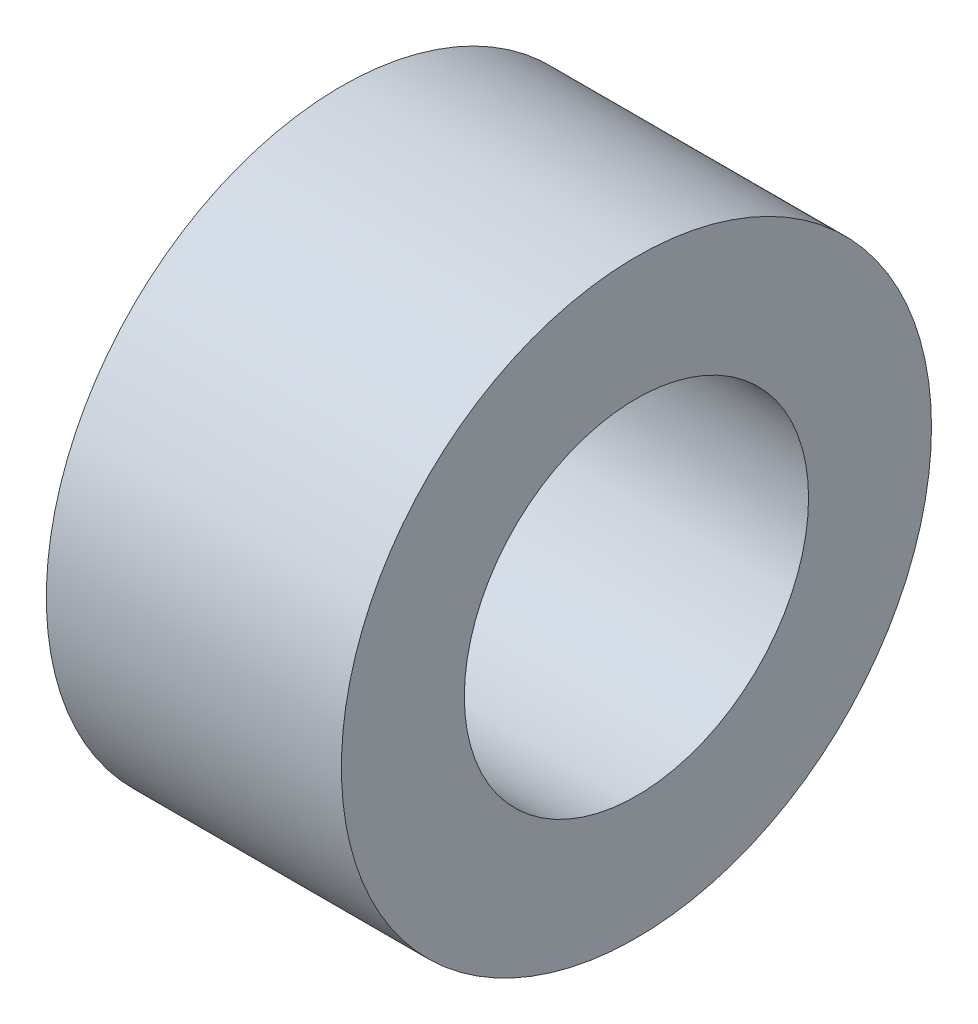
ISO-10303-21;
HEADER;
FILE_DESCRIPTION(('STEP AP214'),'2;1');
FILE_NAME('part.step','',(''),(''),'','','');
FILE_SCHEMA(('AUTOMOTIVE_DESIGN { 1 0 10303 214 1 1 1 1 }'));
ENDSEC;
DATA;
#1=APPLICATION_CONTEXT('core data for automotive mechanical design processes');
#2=APPLICATION_PROTOCOL_DEFINITION('international standard','automotive_design',2000,#1);
#3=PRODUCT_CONTEXT('',#1,'mechanical');
#4=PRODUCT('Part','Part','',(#3));
#5=PRODUCT_RELATED_PRODUCT_CATEGORY('part','',(#4));
#6=PRODUCT_DEFINITION_FORMATION('','',#4);
#7=PRODUCT_DEFINITION_CONTEXT('part definition',#1,'design');
#8=PRODUCT_DEFINITION('design','',#6,#7);
#9=PRODUCT_DEFINITION_SHAPE('','',#8);
#10=(LENGTH_UNIT() NAMED_UNIT(*) SI_UNIT(.MILLI.,.METRE.));
#11=(NAMED_UNIT(*) PLANE_ANGLE_UNIT() SI_UNIT($,.RADIAN.));
#12=(NAMED_UNIT(*) SI_UNIT($,.STERADIAN.) SOLID_ANGLE_UNIT());
#13=UNCERTAINTY_MEASURE_WITH_UNIT(LENGTH_MEASURE(1.E-05),#10,'distance_accuracy_value','');
#14=(GEOMETRIC_REPRESENTATION_CONTEXT(3) GLOBAL_UNCERTAINTY_ASSIGNED_CONTEXT((#13)) GLOBAL_UNIT_ASSIGNED_CONTEXT((#10,
#11,#12)) REPRESENTATION_CONTEXT('',''));
#15=CARTESIAN_POINT('',(0.,0.,0.));
#16=DIRECTION('',(0.,0.,1.));
#17=DIRECTION('',(1.,0.,0.));
#18=AXIS2_PLACEMENT_3D('',#15,#16,#17);
#19=CARTESIAN_POINT('',(3.,0.,0.));
#20=DIRECTION('',(-1.,0.,0.));
#21=DIRECTION('',(0.,0.,1.));
#22=AXIS2_PLACEMENT_3D('',#19,#20,#21);
#23=CYLINDRICAL_SURFACE('',#22,3.5);
#24=CARTESIAN_POINT('',(3.,0.,0.));
#25=DIRECTION('',(1.,0.,0.));
#26=DIRECTION('',(0.,0.,-1.));
#27=AXIS2_PLACEMENT_3D('',#24,#25,#26);
#28=CIRCLE('',#27,3.5);
#29=CARTESIAN_POINT('',(3.,0.,-3.5));
#30=VERTEX_POINT('',#29);
#31=EDGE_CURVE('E40',#30,#30,#28,.T.);
#32=ORIENTED_EDGE('',*,*,#31,.T.);
#33=EDGE_LOOP('',(#32));
#34=FACE_BOUND('',#33,.T.);
#35=CARTESIAN_POINT('',(-3.,0.,0.));
#36=DIRECTION('',(1.,0.,0.));
#37=DIRECTION('',(0.,0.,-1.));
#38=AXIS2_PLACEMENT_3D('',#35,#36,#37);
#39=CIRCLE('',#38,3.5);
#40=CARTESIAN_POINT('',(-3.,0.,-3.5));
#41=VERTEX_POINT('',#40);
#42=EDGE_CURVE('E46',#41,#41,#39,.T.);
#43=ORIENTED_EDGE('',*,*,#42,.F.);
#44=EDGE_LOOP('',(#43));
#45=FACE_BOUND('',#44,.T.);
#46=ADVANCED_FACE('F33',(#34,#45),#23,.F.);
#47=CARTESIAN_POINT('',(3.,0.,0.));
#48=DIRECTION('',(-1.,0.,0.));
#49=DIRECTION('',(0.,0.,1.));
#50=AXIS2_PLACEMENT_3D('',#47,#48,#49);
#51=CYLINDRICAL_SURFACE('',#50,6.);
#52=CARTESIAN_POINT('',(3.,0.,0.));
#53=DIRECTION('',(1.,0.,0.));
#54=DIRECTION('',(0.,0.,-1.));
#55=AXIS2_PLACEMENT_3D('',#52,#53,#54);
#56=CIRCLE('',#55,6.);
#57=CARTESIAN_POINT('',(3.,0.,-6.));
#58=VERTEX_POINT('',#57);
#59=EDGE_CURVE('E10',#58,#58,#56,.T.);
#60=ORIENTED_EDGE('',*,*,#59,.F.);
#61=EDGE_LOOP('',(#60));
#62=FACE_BOUND('',#61,.T.);
#63=CARTESIAN_POINT('',(-3.,0.,0.));
#64=DIRECTION('',(1.,0.,0.));
#65=DIRECTION('',(0.,0.,-1.));
#66=AXIS2_PLACEMENT_3D('',#63,#64,#65);
#67=CIRCLE('',#66,6.);
#68=CARTESIAN_POINT('',(-3.,0.,-6.));
#69=VERTEX_POINT('',#68);
#70=EDGE_CURVE('E36',#69,#69,#67,.T.);
#71=ORIENTED_EDGE('',*,*,#70,.T.);
#72=EDGE_LOOP('',(#71));
#73=FACE_BOUND('',#72,.T.);
#74=ADVANCED_FACE('F53',(#62,#73),#51,.T.);
#75=CARTESIAN_POINT('',(3.,0.,0.));
#76=DIRECTION('',(1.,0.,0.));
#77=DIRECTION('',(0.,0.,-1.));
#78=AXIS2_PLACEMENT_3D('',#75,#76,#77);
#79=PLANE('',#78);
#80=ORIENTED_EDGE('',*,*,#31,.F.);
#81=EDGE_LOOP('',(#80));
#82=FACE_BOUND('',#81,.T.);
#83=ORIENTED_EDGE('',*,*,#59,.T.);
#84=EDGE_LOOP('',(#83));
#85=FACE_BOUND('',#84,.T.);
#86=ADVANCED_FACE('F57',(#82,#85),#79,.T.);
#87=CARTESIAN_POINT('',(-3.,0.,0.));
#88=DIRECTION('',(1.,0.,0.));
#89=DIRECTION('',(0.,0.,-1.));
#90=AXIS2_PLACEMENT_3D('',#87,#88,#89);
#91=PLANE('',#90);
#92=ORIENTED_EDGE('',*,*,#42,.T.);
#93=EDGE_LOOP('',(#92));
#94=FACE_BOUND('',#93,.T.);
#95=ORIENTED_EDGE('',*,*,#70,.F.);
#96=EDGE_LOOP('',(#95));
#97=FACE_BOUND('',#96,.T.);
#98=ADVANCED_FACE('F55',(#94,#97),#91,.F.);
#99=CLOSED_SHELL('',(#46,#74,#86,#98));
#100=MANIFOLD_SOLID_BREP('B2',#99);
#101=ADVANCED_BREP_SHAPE_REPRESENTATION('',(#18,#100),#14);
#102=SHAPE_DEFINITION_REPRESENTATION(#9,#101);
ENDSEC;
END-ISO-10303-21;
